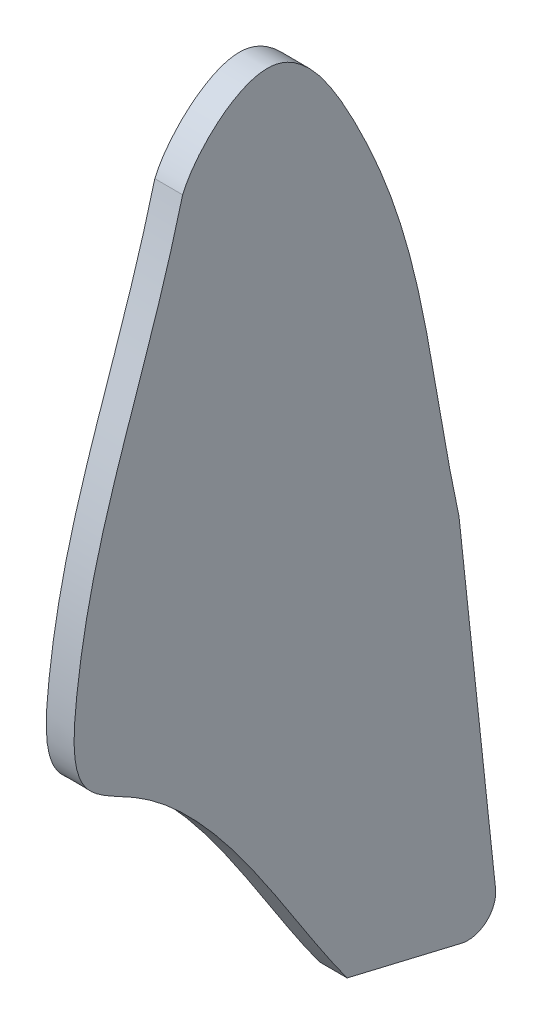
ISO-10303-21;
HEADER;
FILE_DESCRIPTION(('STEP AP214'),'2;1');
FILE_NAME('part.step','',(''),(''),'','','');
FILE_SCHEMA(('AUTOMOTIVE_DESIGN { 1 0 10303 214 1 1 1 1 }'));
ENDSEC;
DATA;
#1=APPLICATION_CONTEXT('core data for automotive mechanical design processes');
#2=APPLICATION_PROTOCOL_DEFINITION('international standard','automotive_design',2000,#1);
#3=PRODUCT_CONTEXT('',#1,'mechanical');
#4=PRODUCT('Part','Part','',(#3));
#5=PRODUCT_RELATED_PRODUCT_CATEGORY('part','',(#4));
#6=PRODUCT_DEFINITION_FORMATION('','',#4);
#7=PRODUCT_DEFINITION_CONTEXT('part definition',#1,'design');
#8=PRODUCT_DEFINITION('design','',#6,#7);
#9=PRODUCT_DEFINITION_SHAPE('','',#8);
#10=(LENGTH_UNIT() NAMED_UNIT(*) SI_UNIT(.MILLI.,.METRE.));
#11=(NAMED_UNIT(*) PLANE_ANGLE_UNIT() SI_UNIT($,.RADIAN.));
#12=(NAMED_UNIT(*) SI_UNIT($,.STERADIAN.) SOLID_ANGLE_UNIT());
#13=UNCERTAINTY_MEASURE_WITH_UNIT(LENGTH_MEASURE(1.E-05),#10,'distance_accuracy_value','');
#14=(GEOMETRIC_REPRESENTATION_CONTEXT(3) GLOBAL_UNCERTAINTY_ASSIGNED_CONTEXT((#13)) GLOBAL_UNIT_ASSIGNED_CONTEXT((#10,
#11,#12)) REPRESENTATION_CONTEXT('',''));
#15=CARTESIAN_POINT('',(0.,0.,0.));
#16=DIRECTION('',(0.,0.,1.));
#17=DIRECTION('',(1.,0.,0.));
#18=AXIS2_PLACEMENT_3D('',#15,#16,#17);
#19=CARTESIAN_POINT('',(15.9977682250777,-300.184165917528,672.198855104565));
#20=DIRECTION('',(-0.999980776589104,0.00606476696064792,0.00129036970132612));
#21=DIRECTION('',(-0.00606477200973636,-0.999981609101122,0.));
#22=AXIS2_PLACEMENT_3D('',#19,#20,#21);
#23=CYLINDRICAL_SURFACE('',#22,2.53999999999762);
#24=CARTESIAN_POINT('',(13.4578170525414,-300.168761409448,672.202132643606));
#25=DIRECTION('',(0.999980776589104,-0.00606476696064792,-0.00129036970132612));
#26=DIRECTION('',(0.00606477200973636,0.999981609101122,0.));
#27=AXIS2_PLACEMENT_3D('',#24,#25,#26);
#28=CIRCLE('',#27,2.53999999999762);
#29=CARTESIAN_POINT('',(13.4435988459564,-302.638926854379,672.793470548068));
#30=VERTEX_POINT('',#29);
#31=CARTESIAN_POINT('',(13.4562866656819,-299.884079405015,669.678137038566));
#32=VERTEX_POINT('',#31);
#33=EDGE_CURVE('E133',#30,#32,#28,.T.);
#34=ORIENTED_EDGE('',*,*,#33,.T.);
#35=DIRECTION('',(-0.999980776589104,0.00606476696064792,0.00129036970132612));
#36=VECTOR('',#35,1.);
#37=CARTESIAN_POINT('',(15.9962378382182,-299.899483913095,669.674859499525));
#38=LINE('',#37,#36);
#39=CARTESIAN_POINT('',(15.9962378382182,-299.899483913095,669.674859499525));
#40=VERTEX_POINT('',#39);
#41=EDGE_CURVE('E11',#40,#32,#38,.T.);
#42=ORIENTED_EDGE('',*,*,#41,.F.);
#43=CARTESIAN_POINT('',(15.9977682250777,-300.184165917528,672.198855104565));
#44=DIRECTION('',(0.999980776589104,-0.00606476696064792,-0.00129036970132612));
#45=DIRECTION('',(0.00606477200973636,0.999981609101122,0.));
#46=AXIS2_PLACEMENT_3D('',#43,#44,#45);
#47=CIRCLE('',#46,2.53999999999762);
#48=CARTESIAN_POINT('',(15.9835500184927,-302.654331362459,672.790193009026));
#49=VERTEX_POINT('',#48);
#50=EDGE_CURVE('E150',#49,#40,#47,.T.);
#51=ORIENTED_EDGE('',*,*,#50,.F.);
#52=DIRECTION('',(-0.999980776589104,0.00606476696064792,0.00129036970132612));
#53=VECTOR('',#52,1.);
#54=CARTESIAN_POINT('',(15.9835500184927,-302.654331362459,672.790193009026));
#55=LINE('',#54,#53);
#56=EDGE_CURVE('E102',#49,#30,#55,.T.);
#57=ORIENTED_EDGE('',*,*,#56,.T.);
#58=EDGE_LOOP('',(#34,#42,#51,#57));
#59=FACE_BOUND('',#58,.T.);
#60=ADVANCED_FACE('F32',(#59),#23,.T.);
#61=CARTESIAN_POINT('',(16.1909749843968,-268.54297890271,673.211448334015));
#62=DIRECTION('',(0.000602514511624382,-0.112079529302991,0.993699057103046));
#63=DIRECTION('',(0.,-0.993699237471268,-0.112079549646761));
#64=AXIS2_PLACEMENT_3D('',#61,#62,#63);
#65=PLANE('',#64);
#66=DIRECTION('',(0.00617117723909707,0.993680732284235,0.112073720642042));
#67=VECTOR('',#66,1.);
#68=CARTESIAN_POINT('',(13.6510238118605,-268.52757439463,673.214725873057));
#69=LINE('',#68,#67);
#70=CARTESIAN_POINT('',(13.6510238118605,-268.52757439463,673.214725873057));
#71=VERTEX_POINT('',#70);
#72=EDGE_CURVE('E128',#32,#71,#69,.T.);
#73=ORIENTED_EDGE('',*,*,#72,.T.);
#74=DIRECTION('',(-0.999980776589104,0.00606476696064792,0.00129036970132612));
#75=VECTOR('',#74,1.);
#76=CARTESIAN_POINT('',(16.1909749843968,-268.54297890271,673.211448334015));
#77=LINE('',#76,#75);
#78=CARTESIAN_POINT('',(16.1909749843968,-268.54297890271,673.211448334015));
#79=VERTEX_POINT('',#78);
#80=EDGE_CURVE('E40',#79,#71,#77,.T.);
#81=ORIENTED_EDGE('',*,*,#80,.F.);
#82=DIRECTION('',(0.00617117723909707,0.993680732284235,0.112073720642042));
#83=VECTOR('',#82,1.);
#84=CARTESIAN_POINT('',(16.1909749843968,-268.54297890271,673.211448334015));
#85=LINE('',#84,#83);
#86=EDGE_CURVE('E82',#40,#79,#85,.T.);
#87=ORIENTED_EDGE('',*,*,#86,.F.);
#88=ORIENTED_EDGE('',*,*,#41,.T.);
#89=EDGE_LOOP('',(#73,#81,#87,#88));
#90=FACE_BOUND('',#89,.T.);
#91=ADVANCED_FACE('F122',(#90),#65,.F.);
#92=CARTESIAN_POINT('',(16.1909749843968,-268.54297890271,673.211448334015));
#93=CARTESIAN_POINT('',(16.2779321486093,-254.850267536308,676.243439164612));
#94=CARTESIAN_POINT('',(16.3562921531577,-241.957006262769,676.370436268585));
#95=CARTESIAN_POINT('',(16.5058404038403,-220.23793947099,690.183762125434));
#96=CARTESIAN_POINT('',(16.4716342991684,-227.468410862533,697.658888735696));
#97=CARTESIAN_POINT('',(16.4567863436396,-230.149820146741,698.755049264666));
#98=B_SPLINE_CURVE_WITH_KNOTS('',3,(#92,#93,#94,#95,#96,#97),.UNSPECIFIED.,.F.,.F.,(4,1,1,4),
(0.,0.643941839471153,0.829751444984745,1.),.UNSPECIFIED.);
#99=DIRECTION('',(-0.999980776589104,0.00606476696064792,0.00129036970132612));
#100=VECTOR('',#99,1.);
#101=SURFACE_OF_LINEAR_EXTRUSION('',#98,#100);
#102=CARTESIAN_POINT('',(13.6510238118605,-268.52757439463,673.214725873057));
#103=CARTESIAN_POINT('',(13.7379809760729,-254.834863028228,676.246716703653));
#104=CARTESIAN_POINT('',(13.8163409806214,-241.941601754689,676.373713807627));
#105=CARTESIAN_POINT('',(13.965889231304,-220.22253496291,690.187039664475));
#106=CARTESIAN_POINT('',(13.9316831266321,-227.453006354453,697.662166274737));
#107=CARTESIAN_POINT('',(13.9168351711033,-230.134415638661,698.758326803708));
#108=B_SPLINE_CURVE_WITH_KNOTS('',3,(#102,#103,#104,#105,#106,#107),.UNSPECIFIED.,.F.,.F.,(4,1,
1,4),(0.,0.643941839471153,0.829751444984745,1.),.UNSPECIFIED.);
#109=CARTESIAN_POINT('',(13.9168351711033,-230.134415638661,698.758326803708));
#110=VERTEX_POINT('',#109);
#111=EDGE_CURVE('E97',#71,#110,#108,.T.);
#112=ORIENTED_EDGE('',*,*,#111,.T.);
#113=DIRECTION('',(-0.999980776589104,0.00606476696064792,0.00129036970132612));
#114=VECTOR('',#113,1.);
#115=CARTESIAN_POINT('',(16.4567863436396,-230.149820146741,698.755049264666));
#116=LINE('',#115,#114);
#117=CARTESIAN_POINT('',(16.4567863436396,-230.149820146741,698.755049264666));
#118=VERTEX_POINT('',#117);
#119=EDGE_CURVE('E94',#118,#110,#116,.T.);
#120=ORIENTED_EDGE('',*,*,#119,.F.);
#121=EDGE_CURVE('E86',#79,#118,#98,.T.);
#122=ORIENTED_EDGE('',*,*,#121,.F.);
#123=ORIENTED_EDGE('',*,*,#80,.T.);
#124=EDGE_LOOP('',(#112,#120,#122,#123));
#125=FACE_BOUND('',#124,.T.);
#126=ADVANCED_FACE('F95',(#125),#101,.F.);
#127=CARTESIAN_POINT('',(16.4567863436396,-230.149820146741,698.755049264666));
#128=CARTESIAN_POINT('',(16.3777099947029,-243.9248022226,702.217024040642));
#129=CARTESIAN_POINT('',(16.3234587759981,-254.078040206647,707.895122689692));
#130=CARTESIAN_POINT('',(16.208756616742,-273.179806178989,708.784638979923));
#131=CARTESIAN_POINT('',(16.1841851605264,-275.878144460716,702.425073190142));
#132=CARTESIAN_POINT('',(16.1250789992234,-283.663933838577,693.213738727302));
#133=CARTESIAN_POINT('',(16.0585396378701,-293.545201175262,688.090789420481));
#134=CARTESIAN_POINT('',(16.0122797784064,-300.14639495633,683.267157680923));
#135=B_SPLINE_CURVE_WITH_KNOTS('',3,(#127,#128,#129,#130,#131,#132,#133,#134),.UNSPECIFIED.,.F.,
.F.,(4,1,1,1,1,4),(0.,0.455993599975223,0.548053039696748,0.607593538933106,0.690343512478959,
1.),.UNSPECIFIED.);
#136=DIRECTION('',(-0.999980776589104,0.00606476696064792,0.00129036970132612));
#137=VECTOR('',#136,1.);
#138=SURFACE_OF_LINEAR_EXTRUSION('',#135,#137);
#139=CARTESIAN_POINT('',(13.9168351711033,-230.134415638661,698.758326803708));
#140=CARTESIAN_POINT('',(13.8377588221666,-243.90939771452,702.220301579683));
#141=CARTESIAN_POINT('',(13.7835076034618,-254.062635698567,707.898400228733));
#142=CARTESIAN_POINT('',(13.6688054442057,-273.164401670909,708.787916518964));
#143=CARTESIAN_POINT('',(13.6442339879901,-275.862739952636,702.428350729183));
#144=CARTESIAN_POINT('',(13.585127826687,-283.648529330497,693.217016266344));
#145=CARTESIAN_POINT('',(13.5185884653337,-293.529796667182,688.094066959522));
#146=CARTESIAN_POINT('',(13.4723286058701,-300.13099044825,683.270435219965));
#147=B_SPLINE_CURVE_WITH_KNOTS('',3,(#139,#140,#141,#142,#143,#144,#145,#146),.UNSPECIFIED.,.F.,
.F.,(4,1,1,1,1,4),(0.,0.455993599975223,0.548053039696748,0.607593538933106,0.690343512478959,
1.),.UNSPECIFIED.);
#148=CARTESIAN_POINT('',(13.4723286058701,-300.13099044825,683.270435219965));
#149=VERTEX_POINT('',#148);
#150=EDGE_CURVE('E68',#110,#149,#147,.T.);
#151=ORIENTED_EDGE('',*,*,#150,.T.);
#152=DIRECTION('',(-0.999980776589104,0.00606476696064792,0.00129036970132612));
#153=VECTOR('',#152,1.);
#154=CARTESIAN_POINT('',(16.0122797784064,-300.14639495633,683.267157680924));
#155=LINE('',#154,#153);
#156=CARTESIAN_POINT('',(16.0122797784064,-300.14639495633,683.267157680924));
#157=VERTEX_POINT('',#156);
#158=EDGE_CURVE('E98',#157,#149,#155,.T.);
#159=ORIENTED_EDGE('',*,*,#158,.F.);
#160=EDGE_CURVE('E90',#118,#157,#135,.T.);
#161=ORIENTED_EDGE('',*,*,#160,.F.);
#162=ORIENTED_EDGE('',*,*,#119,.T.);
#163=EDGE_LOOP('',(#151,#159,#161,#162));
#164=FACE_BOUND('',#163,.T.);
#165=ADVANCED_FACE('F100',(#164),#138,.F.);
#166=CARTESIAN_POINT('',(15.9835500184927,-302.654331362459,672.790193009026));
#167=DIRECTION('',(0.00559771912796961,0.972506080683061,-0.232810198606153));
#168=DIRECTION('',(0.,0.232813846182737,0.972521317517308));
#169=AXIS2_PLACEMENT_3D('',#166,#167,#168);
#170=PLANE('',#169);
#171=DIRECTION('',(-0.00266683198147728,-0.232798500072885,-0.972521334661095));
#172=VECTOR('',#171,1.);
#173=CARTESIAN_POINT('',(13.4435988459564,-302.638926854379,672.793470548068));
#174=LINE('',#173,#172);
#175=EDGE_CURVE('E74',#149,#30,#174,.T.);
#176=ORIENTED_EDGE('',*,*,#175,.T.);
#177=ORIENTED_EDGE('',*,*,#56,.F.);
#178=DIRECTION('',(-0.00266683198147728,-0.232798500072885,-0.972521334661095));
#179=VECTOR('',#178,1.);
#180=CARTESIAN_POINT('',(15.9835500184927,-302.654331362459,672.790193009026));
#181=LINE('',#180,#179);
#182=EDGE_CURVE('E48',#157,#49,#181,.T.);
#183=ORIENTED_EDGE('',*,*,#182,.F.);
#184=ORIENTED_EDGE('',*,*,#158,.T.);
#185=EDGE_LOOP('',(#176,#177,#183,#184));
#186=FACE_BOUND('',#185,.T.);
#187=ADVANCED_FACE('F119',(#186),#170,.F.);
#188=CARTESIAN_POINT('',(15.9977682250777,-300.184165917528,672.198855104565));
#189=DIRECTION('',(0.999980776589104,-0.00606476696064792,-0.00129036970132612));
#190=DIRECTION('',(0.00606477200973636,0.999981609101122,0.));
#191=AXIS2_PLACEMENT_3D('',#188,#189,#190);
#192=PLANE('',#191);
#193=ORIENTED_EDGE('',*,*,#50,.T.);
#194=ORIENTED_EDGE('',*,*,#86,.T.);
#195=ORIENTED_EDGE('',*,*,#121,.T.);
#196=ORIENTED_EDGE('',*,*,#160,.T.);
#197=ORIENTED_EDGE('',*,*,#182,.T.);
#198=EDGE_LOOP('',(#193,#194,#195,#196,#197));
#199=FACE_BOUND('',#198,.T.);
#200=ADVANCED_FACE('F88',(#199),#192,.T.);
#201=CARTESIAN_POINT('',(13.4578170525414,-300.168761409448,672.202132643606));
#202=DIRECTION('',(0.999980776589104,-0.00606476696064792,-0.00129036970132612));
#203=DIRECTION('',(0.00606477200973636,0.999981609101122,0.));
#204=AXIS2_PLACEMENT_3D('',#201,#202,#203);
#205=PLANE('',#204);
#206=ORIENTED_EDGE('',*,*,#33,.F.);
#207=ORIENTED_EDGE('',*,*,#175,.F.);
#208=ORIENTED_EDGE('',*,*,#150,.F.);
#209=ORIENTED_EDGE('',*,*,#111,.F.);
#210=ORIENTED_EDGE('',*,*,#72,.F.);
#211=EDGE_LOOP('',(#206,#207,#208,#209,#210));
#212=FACE_BOUND('',#211,.T.);
#213=ADVANCED_FACE('F135',(#212),#205,.F.);
#214=CLOSED_SHELL('',(#60,#91,#126,#165,#187,#200,#213));
#215=MANIFOLD_SOLID_BREP('B2',#214);
#216=ADVANCED_BREP_SHAPE_REPRESENTATION('',(#18,#215),#14);
#217=SHAPE_DEFINITION_REPRESENTATION(#9,#216);
ENDSEC;
END-ISO-10303-21;
